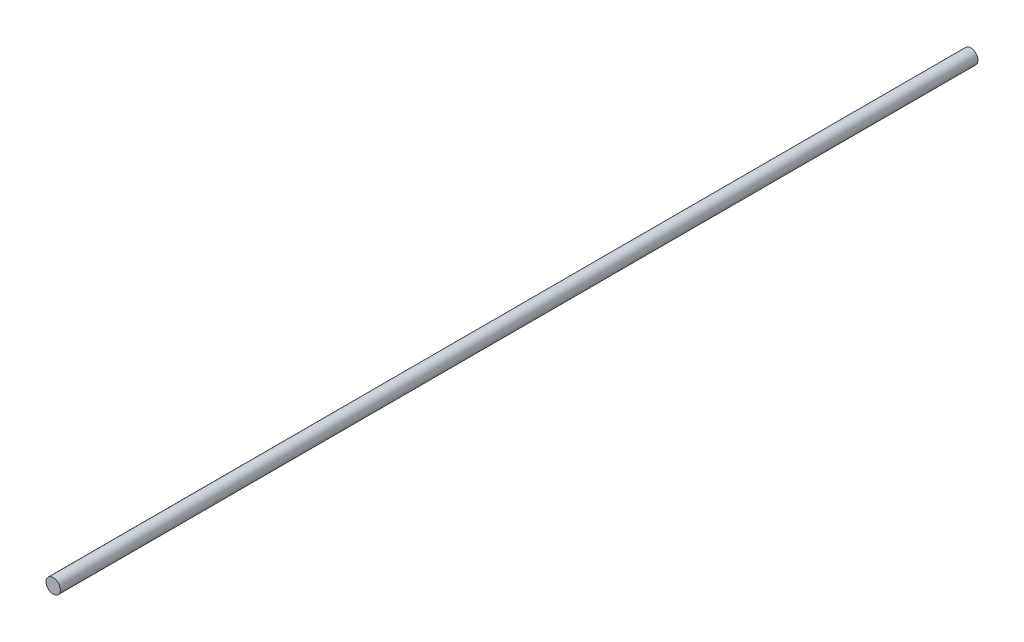
ISO-10303-21;
HEADER;
FILE_DESCRIPTION(('STEP AP214'),'2;1');
FILE_NAME('part.step','',(''),(''),'','','');
FILE_SCHEMA(('AUTOMOTIVE_DESIGN { 1 0 10303 214 1 1 1 1 }'));
ENDSEC;
DATA;
#1=APPLICATION_CONTEXT('core data for automotive mechanical design processes');
#2=APPLICATION_PROTOCOL_DEFINITION('international standard','automotive_design',2000,#1);
#3=PRODUCT_CONTEXT('',#1,'mechanical');
#4=PRODUCT('Part','Part','',(#3));
#5=PRODUCT_RELATED_PRODUCT_CATEGORY('part','',(#4));
#6=PRODUCT_DEFINITION_FORMATION('','',#4);
#7=PRODUCT_DEFINITION_CONTEXT('part definition',#1,'design');
#8=PRODUCT_DEFINITION('design','',#6,#7);
#9=PRODUCT_DEFINITION_SHAPE('','',#8);
#10=(LENGTH_UNIT() NAMED_UNIT(*) SI_UNIT(.MILLI.,.METRE.));
#11=(NAMED_UNIT(*) PLANE_ANGLE_UNIT() SI_UNIT($,.RADIAN.));
#12=(NAMED_UNIT(*) SI_UNIT($,.STERADIAN.) SOLID_ANGLE_UNIT());
#13=UNCERTAINTY_MEASURE_WITH_UNIT(LENGTH_MEASURE(1.E-05),#10,'distance_accuracy_value','');
#14=(GEOMETRIC_REPRESENTATION_CONTEXT(3) GLOBAL_UNCERTAINTY_ASSIGNED_CONTEXT((#13)) GLOBAL_UNIT_ASSIGNED_CONTEXT((#10,
#11,#12)) REPRESENTATION_CONTEXT('',''));
#15=CARTESIAN_POINT('',(0.,0.,0.));
#16=DIRECTION('',(0.,0.,1.));
#17=DIRECTION('',(1.,0.,0.));
#18=AXIS2_PLACEMENT_3D('',#15,#16,#17);
#19=CARTESIAN_POINT('',(-14.8142857142857,7.89285714285715,511.42));
#20=DIRECTION('',(0.,0.,-1.));
#21=DIRECTION('',(-1.,0.,0.));
#22=AXIS2_PLACEMENT_3D('',#19,#20,#21);
#23=CYLINDRICAL_SURFACE('',#22,4.);
#24=CARTESIAN_POINT('',(-14.8142857142857,7.89285714285715,511.42));
#25=DIRECTION('',(0.,0.,1.));
#26=DIRECTION('',(1.,0.,0.));
#27=AXIS2_PLACEMENT_3D('',#24,#25,#26);
#28=CIRCLE('',#27,4.);
#29=CARTESIAN_POINT('',(-10.8142857142857,7.89285714285715,511.42));
#30=VERTEX_POINT('',#29);
#31=EDGE_CURVE('E10',#30,#30,#28,.T.);
#32=ORIENTED_EDGE('',*,*,#31,.F.);
#33=EDGE_LOOP('',(#32));
#34=FACE_BOUND('',#33,.T.);
#35=CARTESIAN_POINT('',(-14.8142857142857,7.89285714285715,0.));
#36=DIRECTION('',(0.,0.,1.));
#37=DIRECTION('',(1.,0.,0.));
#38=AXIS2_PLACEMENT_3D('',#35,#36,#37);
#39=CIRCLE('',#38,4.);
#40=CARTESIAN_POINT('',(-10.8142857142857,7.89285714285715,0.));
#41=VERTEX_POINT('',#40);
#42=EDGE_CURVE('E34',#41,#41,#39,.T.);
#43=ORIENTED_EDGE('',*,*,#42,.T.);
#44=EDGE_LOOP('',(#43));
#45=FACE_BOUND('',#44,.T.);
#46=ADVANCED_FACE('F31',(#34,#45),#23,.T.);
#47=CARTESIAN_POINT('',(-14.8142857142857,7.89285714285715,511.42));
#48=DIRECTION('',(0.,0.,1.));
#49=DIRECTION('',(1.,0.,0.));
#50=AXIS2_PLACEMENT_3D('',#47,#48,#49);
#51=PLANE('',#50);
#52=ORIENTED_EDGE('',*,*,#31,.T.);
#53=EDGE_LOOP('',(#52));
#54=FACE_BOUND('',#53,.T.);
#55=ADVANCED_FACE('F46',(#54),#51,.T.);
#56=CARTESIAN_POINT('',(-14.8142857142857,7.89285714285715,0.));
#57=DIRECTION('',(0.,0.,1.));
#58=DIRECTION('',(1.,0.,0.));
#59=AXIS2_PLACEMENT_3D('',#56,#57,#58);
#60=PLANE('',#59);
#61=ORIENTED_EDGE('',*,*,#42,.F.);
#62=EDGE_LOOP('',(#61));
#63=FACE_BOUND('',#62,.T.);
#64=ADVANCED_FACE('F44',(#63),#60,.F.);
#65=CLOSED_SHELL('',(#46,#55,#64));
#66=MANIFOLD_SOLID_BREP('B2',#65);
#67=ADVANCED_BREP_SHAPE_REPRESENTATION('',(#18,#66),#14);
#68=SHAPE_DEFINITION_REPRESENTATION(#9,#67);
ENDSEC;
END-ISO-10303-21;
